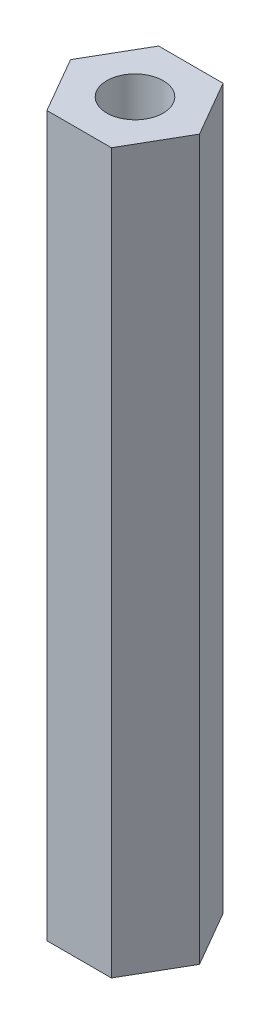
ISO-10303-21;
HEADER;
FILE_DESCRIPTION(('STEP AP214'),'2;1');
FILE_NAME('part.step','',(''),(''),'','','');
FILE_SCHEMA(('AUTOMOTIVE_DESIGN { 1 0 10303 214 1 1 1 1 }'));
ENDSEC;
DATA;
#1=APPLICATION_CONTEXT('core data for automotive mechanical design processes');
#2=APPLICATION_PROTOCOL_DEFINITION('international standard','automotive_design',2000,#1);
#3=PRODUCT_CONTEXT('',#1,'mechanical');
#4=PRODUCT('Part','Part','',(#3));
#5=PRODUCT_RELATED_PRODUCT_CATEGORY('part','',(#4));
#6=PRODUCT_DEFINITION_FORMATION('','',#4);
#7=PRODUCT_DEFINITION_CONTEXT('part definition',#1,'design');
#8=PRODUCT_DEFINITION('design','',#6,#7);
#9=PRODUCT_DEFINITION_SHAPE('','',#8);
#10=(LENGTH_UNIT() NAMED_UNIT(*) SI_UNIT(.MILLI.,.METRE.));
#11=(NAMED_UNIT(*) PLANE_ANGLE_UNIT() SI_UNIT($,.RADIAN.));
#12=(NAMED_UNIT(*) SI_UNIT($,.STERADIAN.) SOLID_ANGLE_UNIT());
#13=UNCERTAINTY_MEASURE_WITH_UNIT(LENGTH_MEASURE(1.E-05),#10,'distance_accuracy_value','');
#14=(GEOMETRIC_REPRESENTATION_CONTEXT(3) GLOBAL_UNCERTAINTY_ASSIGNED_CONTEXT((#13)) GLOBAL_UNIT_ASSIGNED_CONTEXT((#10,
#11,#12)) REPRESENTATION_CONTEXT('',''));
#15=CARTESIAN_POINT('',(0.,0.,0.));
#16=DIRECTION('',(0.,0.,1.));
#17=DIRECTION('',(1.,0.,0.));
#18=AXIS2_PLACEMENT_3D('',#15,#16,#17);
#19=CARTESIAN_POINT('',(0.,30.,0.));
#20=DIRECTION('',(0.,1.,0.));
#21=DIRECTION('',(0.,0.,1.));
#22=AXIS2_PLACEMENT_3D('',#19,#20,#21);
#23=PLANE('',#22);
#24=DIRECTION('',(0.499999999999995,0.,-0.866025403784441));
#25=VECTOR('',#24,1.);
#26=CARTESIAN_POINT('',(1.34522612721185,30.,2.32999999999998));
#27=LINE('',#26,#25);
#28=CARTESIAN_POINT('',(1.34522612721185,30.,2.32999999999998));
#29=VERTEX_POINT('',#28);
#30=CARTESIAN_POINT('',(2.69045225442365,30.,0.));
#31=VERTEX_POINT('',#30);
#32=EDGE_CURVE('E132',#29,#31,#27,.T.);
#33=ORIENTED_EDGE('',*,*,#32,.T.);
#34=DIRECTION('',(-0.500000000000001,0.,-0.866025403784438));
#35=VECTOR('',#34,1.);
#36=CARTESIAN_POINT('',(2.69045225442365,30.,0.));
#37=LINE('',#36,#35);
#38=CARTESIAN_POINT('',(1.34522612721182,30.,-2.33));
#39=VERTEX_POINT('',#38);
#40=EDGE_CURVE('E90',#31,#39,#37,.T.);
#41=ORIENTED_EDGE('',*,*,#40,.T.);
#42=DIRECTION('',(-1.,0.,0.));
#43=VECTOR('',#42,1.);
#44=CARTESIAN_POINT('',(1.34522612721182,30.,-2.33));
#45=LINE('',#44,#43);
#46=CARTESIAN_POINT('',(-1.34522612721184,30.,-2.32999999999999));
#47=VERTEX_POINT('',#46);
#48=EDGE_CURVE('E103',#39,#47,#45,.T.);
#49=ORIENTED_EDGE('',*,*,#48,.T.);
#50=DIRECTION('',(-0.499999999999995,0.,0.866025403784441));
#51=VECTOR('',#50,1.);
#52=CARTESIAN_POINT('',(-1.34522612721184,30.,-2.32999999999999));
#53=LINE('',#52,#51);
#54=CARTESIAN_POINT('',(-2.69045225442365,30.,0.));
#55=VERTEX_POINT('',#54);
#56=EDGE_CURVE('E97',#47,#55,#53,.T.);
#57=ORIENTED_EDGE('',*,*,#56,.T.);
#58=DIRECTION('',(0.500000000000007,0.,0.866025403784435));
#59=VECTOR('',#58,1.);
#60=CARTESIAN_POINT('',(-2.69045225442365,30.,0.));
#61=LINE('',#60,#59);
#62=CARTESIAN_POINT('',(-1.3452261272118,30.,2.33000000000001));
#63=VERTEX_POINT('',#62);
#64=EDGE_CURVE('E101',#55,#63,#61,.T.);
#65=ORIENTED_EDGE('',*,*,#64,.T.);
#66=DIRECTION('',(1.,0.,0.));
#67=VECTOR('',#66,1.);
#68=CARTESIAN_POINT('',(-1.3452261272118,30.,2.33000000000001));
#69=LINE('',#68,#67);
#70=EDGE_CURVE('E53',#63,#29,#69,.T.);
#71=ORIENTED_EDGE('',*,*,#70,.T.);
#72=EDGE_LOOP('',(#33,#41,#49,#57,#65,#71));
#73=FACE_BOUND('',#72,.T.);
#74=CARTESIAN_POINT('',(0.,30.,0.));
#75=DIRECTION('',(0.,1.,0.));
#76=DIRECTION('',(0.,0.,1.));
#77=AXIS2_PLACEMENT_3D('',#74,#75,#76);
#78=CIRCLE('',#77,1.175);
#79=CARTESIAN_POINT('',(0.,30.,1.175));
#80=VERTEX_POINT('',#79);
#81=EDGE_CURVE('E125',#80,#80,#78,.T.);
#82=ORIENTED_EDGE('',*,*,#81,.F.);
#83=EDGE_LOOP('',(#82));
#84=FACE_BOUND('',#83,.T.);
#85=ADVANCED_FACE('F36',(#73,#84),#23,.T.);
#86=CARTESIAN_POINT('',(0.,0.,0.));
#87=DIRECTION('',(0.,1.,0.));
#88=DIRECTION('',(0.,0.,1.));
#89=AXIS2_PLACEMENT_3D('',#86,#87,#88);
#90=PLANE('',#89);
#91=DIRECTION('',(0.499999999999995,0.,-0.866025403784441));
#92=VECTOR('',#91,1.);
#93=CARTESIAN_POINT('',(1.34522612721185,0.,2.32999999999998));
#94=LINE('',#93,#92);
#95=CARTESIAN_POINT('',(1.34522612721185,0.,2.32999999999998));
#96=VERTEX_POINT('',#95);
#97=CARTESIAN_POINT('',(2.69045225442365,0.,0.));
#98=VERTEX_POINT('',#97);
#99=EDGE_CURVE('E121',#96,#98,#94,.T.);
#100=ORIENTED_EDGE('',*,*,#99,.F.);
#101=DIRECTION('',(1.,0.,0.));
#102=VECTOR('',#101,1.);
#103=CARTESIAN_POINT('',(-1.3452261272118,0.,2.33000000000001));
#104=LINE('',#103,#102);
#105=CARTESIAN_POINT('',(-1.3452261272118,0.,2.33000000000001));
#106=VERTEX_POINT('',#105);
#107=EDGE_CURVE('E82',#106,#96,#104,.T.);
#108=ORIENTED_EDGE('',*,*,#107,.F.);
#109=DIRECTION('',(0.500000000000007,0.,0.866025403784435));
#110=VECTOR('',#109,1.);
#111=CARTESIAN_POINT('',(-2.69045225442365,0.,0.));
#112=LINE('',#111,#110);
#113=CARTESIAN_POINT('',(-2.69045225442365,0.,0.));
#114=VERTEX_POINT('',#113);
#115=EDGE_CURVE('E76',#114,#106,#112,.T.);
#116=ORIENTED_EDGE('',*,*,#115,.F.);
#117=DIRECTION('',(-0.499999999999995,0.,0.866025403784441));
#118=VECTOR('',#117,1.);
#119=CARTESIAN_POINT('',(-1.34522612721184,0.,-2.32999999999999));
#120=LINE('',#119,#118);
#121=CARTESIAN_POINT('',(-1.34522612721184,0.,-2.32999999999999));
#122=VERTEX_POINT('',#121);
#123=EDGE_CURVE('E111',#122,#114,#120,.T.);
#124=ORIENTED_EDGE('',*,*,#123,.F.);
#125=DIRECTION('',(-1.,0.,0.));
#126=VECTOR('',#125,1.);
#127=CARTESIAN_POINT('',(1.34522612721182,0.,-2.33));
#128=LINE('',#127,#126);
#129=CARTESIAN_POINT('',(1.34522612721182,0.,-2.33));
#130=VERTEX_POINT('',#129);
#131=EDGE_CURVE('E127',#130,#122,#128,.T.);
#132=ORIENTED_EDGE('',*,*,#131,.F.);
#133=DIRECTION('',(-0.500000000000001,0.,-0.866025403784438));
#134=VECTOR('',#133,1.);
#135=CARTESIAN_POINT('',(2.69045225442365,0.,0.));
#136=LINE('',#135,#134);
#137=EDGE_CURVE('E124',#98,#130,#136,.T.);
#138=ORIENTED_EDGE('',*,*,#137,.F.);
#139=EDGE_LOOP('',(#100,#108,#116,#124,#132,#138));
#140=FACE_BOUND('',#139,.T.);
#141=CARTESIAN_POINT('',(0.,0.,0.));
#142=DIRECTION('',(0.,1.,0.));
#143=DIRECTION('',(0.,0.,1.));
#144=AXIS2_PLACEMENT_3D('',#141,#142,#143);
#145=CIRCLE('',#144,1.175);
#146=CARTESIAN_POINT('',(0.,0.,1.175));
#147=VERTEX_POINT('',#146);
#148=EDGE_CURVE('E225',#147,#147,#145,.T.);
#149=ORIENTED_EDGE('',*,*,#148,.T.);
#150=EDGE_LOOP('',(#149));
#151=FACE_BOUND('',#150,.T.);
#152=ADVANCED_FACE('F141',(#140,#151),#90,.F.);
#153=CARTESIAN_POINT('',(1.34522612721185,30.,2.32999999999998));
#154=DIRECTION('',(-0.866025403784441,0.,-0.499999999999995));
#155=DIRECTION('',(-0.499999999999995,0.,0.866025403784441));
#156=AXIS2_PLACEMENT_3D('',#153,#154,#155);
#157=PLANE('',#156);
#158=ORIENTED_EDGE('',*,*,#99,.T.);
#159=DIRECTION('',(0.,-1.,0.));
#160=VECTOR('',#159,1.);
#161=CARTESIAN_POINT('',(2.69045225442365,30.,0.));
#162=LINE('',#161,#160);
#163=EDGE_CURVE('E11',#31,#98,#162,.T.);
#164=ORIENTED_EDGE('',*,*,#163,.F.);
#165=ORIENTED_EDGE('',*,*,#32,.F.);
#166=DIRECTION('',(0.,-1.,0.));
#167=VECTOR('',#166,1.);
#168=CARTESIAN_POINT('',(1.34522612721185,30.,2.32999999999998));
#169=LINE('',#168,#167);
#170=EDGE_CURVE('E117',#29,#96,#169,.T.);
#171=ORIENTED_EDGE('',*,*,#170,.T.);
#172=EDGE_LOOP('',(#158,#164,#165,#171));
#173=FACE_BOUND('',#172,.T.);
#174=ADVANCED_FACE('F38',(#173),#157,.F.);
#175=CARTESIAN_POINT('',(2.69045225442365,30.,0.));
#176=DIRECTION('',(-0.866025403784438,0.,0.500000000000001));
#177=DIRECTION('',(0.500000000000001,0.,0.866025403784438));
#178=AXIS2_PLACEMENT_3D('',#175,#176,#177);
#179=PLANE('',#178);
#180=ORIENTED_EDGE('',*,*,#137,.T.);
#181=DIRECTION('',(0.,-1.,0.));
#182=VECTOR('',#181,1.);
#183=CARTESIAN_POINT('',(1.34522612721182,30.,-2.33));
#184=LINE('',#183,#182);
#185=EDGE_CURVE('E45',#39,#130,#184,.T.);
#186=ORIENTED_EDGE('',*,*,#185,.F.);
#187=ORIENTED_EDGE('',*,*,#40,.F.);
#188=ORIENTED_EDGE('',*,*,#163,.T.);
#189=EDGE_LOOP('',(#180,#186,#187,#188));
#190=FACE_BOUND('',#189,.T.);
#191=ADVANCED_FACE('F166',(#190),#179,.F.);
#192=CARTESIAN_POINT('',(1.34522612721182,30.,-2.33));
#193=DIRECTION('',(0.,0.,1.));
#194=DIRECTION('',(1.,0.,0.));
#195=AXIS2_PLACEMENT_3D('',#192,#193,#194);
#196=PLANE('',#195);
#197=ORIENTED_EDGE('',*,*,#131,.T.);
#198=DIRECTION('',(0.,-1.,0.));
#199=VECTOR('',#198,1.);
#200=CARTESIAN_POINT('',(-1.34522612721184,30.,-2.32999999999999));
#201=LINE('',#200,#199);
#202=EDGE_CURVE('E112',#47,#122,#201,.T.);
#203=ORIENTED_EDGE('',*,*,#202,.F.);
#204=ORIENTED_EDGE('',*,*,#48,.F.);
#205=ORIENTED_EDGE('',*,*,#185,.T.);
#206=EDGE_LOOP('',(#197,#203,#204,#205));
#207=FACE_BOUND('',#206,.T.);
#208=ADVANCED_FACE('F138',(#207),#196,.F.);
#209=CARTESIAN_POINT('',(-1.34522612721184,30.,-2.32999999999999));
#210=DIRECTION('',(0.866025403784441,0.,0.499999999999995));
#211=DIRECTION('',(0.499999999999995,0.,-0.866025403784441));
#212=AXIS2_PLACEMENT_3D('',#209,#210,#211);
#213=PLANE('',#212);
#214=ORIENTED_EDGE('',*,*,#123,.T.);
#215=DIRECTION('',(0.,-1.,0.));
#216=VECTOR('',#215,1.);
#217=CARTESIAN_POINT('',(-2.69045225442365,30.,0.));
#218=LINE('',#217,#216);
#219=EDGE_CURVE('E108',#55,#114,#218,.T.);
#220=ORIENTED_EDGE('',*,*,#219,.F.);
#221=ORIENTED_EDGE('',*,*,#56,.F.);
#222=ORIENTED_EDGE('',*,*,#202,.T.);
#223=EDGE_LOOP('',(#214,#220,#221,#222));
#224=FACE_BOUND('',#223,.T.);
#225=ADVANCED_FACE('F109',(#224),#213,.F.);
#226=CARTESIAN_POINT('',(-2.69045225442365,30.,0.));
#227=DIRECTION('',(0.866025403784434,0.,-0.500000000000007));
#228=DIRECTION('',(-0.500000000000007,0.,-0.866025403784435));
#229=AXIS2_PLACEMENT_3D('',#226,#227,#228);
#230=PLANE('',#229);
#231=ORIENTED_EDGE('',*,*,#115,.T.);
#232=DIRECTION('',(0.,-1.,0.));
#233=VECTOR('',#232,1.);
#234=CARTESIAN_POINT('',(-1.3452261272118,30.,2.33000000000001));
#235=LINE('',#234,#233);
#236=EDGE_CURVE('E113',#63,#106,#235,.T.);
#237=ORIENTED_EDGE('',*,*,#236,.F.);
#238=ORIENTED_EDGE('',*,*,#64,.F.);
#239=ORIENTED_EDGE('',*,*,#219,.T.);
#240=EDGE_LOOP('',(#231,#237,#238,#239));
#241=FACE_BOUND('',#240,.T.);
#242=ADVANCED_FACE('F115',(#241),#230,.F.);
#243=CARTESIAN_POINT('',(-1.3452261272118,30.,2.33000000000001));
#244=DIRECTION('',(0.,0.,-1.));
#245=DIRECTION('',(-1.,0.,0.));
#246=AXIS2_PLACEMENT_3D('',#243,#244,#245);
#247=PLANE('',#246);
#248=ORIENTED_EDGE('',*,*,#107,.T.);
#249=ORIENTED_EDGE('',*,*,#170,.F.);
#250=ORIENTED_EDGE('',*,*,#70,.F.);
#251=ORIENTED_EDGE('',*,*,#236,.T.);
#252=EDGE_LOOP('',(#248,#249,#250,#251));
#253=FACE_BOUND('',#252,.T.);
#254=ADVANCED_FACE('F146',(#253),#247,.F.);
#255=CARTESIAN_POINT('',(0.,30.,0.));
#256=DIRECTION('',(0.,-1.,0.));
#257=DIRECTION('',(0.,0.,-1.));
#258=AXIS2_PLACEMENT_3D('',#255,#256,#257);
#259=CYLINDRICAL_SURFACE('',#258,1.175);
#260=ORIENTED_EDGE('',*,*,#81,.T.);
#261=EDGE_LOOP('',(#260));
#262=FACE_BOUND('',#261,.T.);
#263=ORIENTED_EDGE('',*,*,#148,.F.);
#264=EDGE_LOOP('',(#263));
#265=FACE_BOUND('',#264,.T.);
#266=ADVANCED_FACE('F148',(#262,#265),#259,.F.);
#267=CLOSED_SHELL('',(#85,#152,#174,#191,#208,#225,#242,#254,#266));
#268=MANIFOLD_SOLID_BREP('B2',#267);
#269=ADVANCED_BREP_SHAPE_REPRESENTATION('',(#18,#268),#14);
#270=SHAPE_DEFINITION_REPRESENTATION(#9,#269);
ENDSEC;
END-ISO-10303-21;
